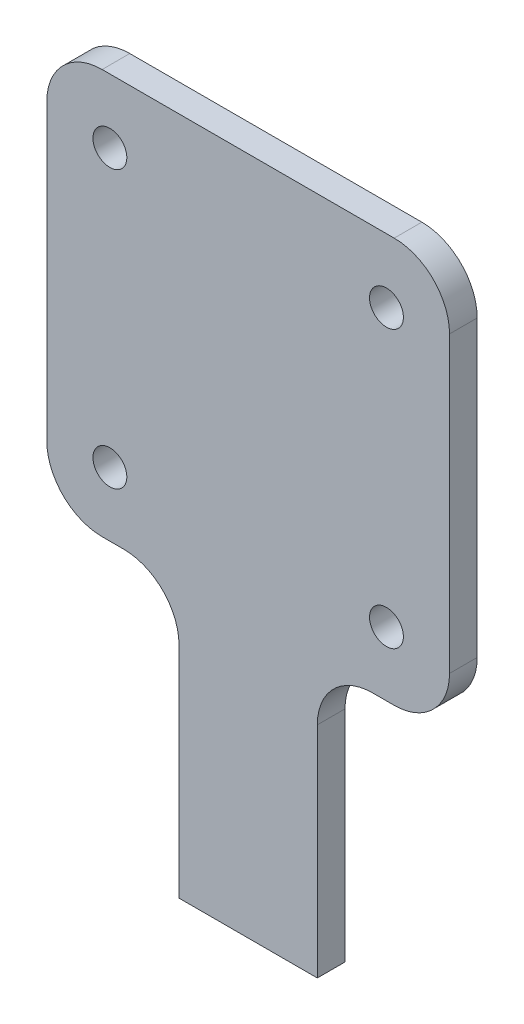
ISO-10303-21;
HEADER;
FILE_DESCRIPTION(('STEP AP214'),'2;1');
FILE_NAME('part.step','',(''),(''),'','','');
FILE_SCHEMA(('AUTOMOTIVE_DESIGN { 1 0 10303 214 1 1 1 1 }'));
ENDSEC;
DATA;
#1=APPLICATION_CONTEXT('core data for automotive mechanical design processes');
#2=APPLICATION_PROTOCOL_DEFINITION('international standard','automotive_design',2000,#1);
#3=PRODUCT_CONTEXT('',#1,'mechanical');
#4=PRODUCT('Part','Part','',(#3));
#5=PRODUCT_RELATED_PRODUCT_CATEGORY('part','',(#4));
#6=PRODUCT_DEFINITION_FORMATION('','',#4);
#7=PRODUCT_DEFINITION_CONTEXT('part definition',#1,'design');
#8=PRODUCT_DEFINITION('design','',#6,#7);
#9=PRODUCT_DEFINITION_SHAPE('','',#8);
#10=(LENGTH_UNIT() NAMED_UNIT(*) SI_UNIT(.MILLI.,.METRE.));
#11=(NAMED_UNIT(*) PLANE_ANGLE_UNIT() SI_UNIT($,.RADIAN.));
#12=(NAMED_UNIT(*) SI_UNIT($,.STERADIAN.) SOLID_ANGLE_UNIT());
#13=UNCERTAINTY_MEASURE_WITH_UNIT(LENGTH_MEASURE(1.E-05),#10,'distance_accuracy_value','');
#14=(GEOMETRIC_REPRESENTATION_CONTEXT(3) GLOBAL_UNCERTAINTY_ASSIGNED_CONTEXT((#13)) GLOBAL_UNIT_ASSIGNED_CONTEXT((#10,
#11,#12)) REPRESENTATION_CONTEXT('',''));
#15=CARTESIAN_POINT('',(0.,0.,0.));
#16=DIRECTION('',(0.,0.,1.));
#17=DIRECTION('',(1.,0.,0.));
#18=AXIS2_PLACEMENT_3D('',#15,#16,#17);
#19=CARTESIAN_POINT('',(-5.,19.8535588758529,1.));
#20=DIRECTION('',(1.,0.,0.));
#21=DIRECTION('',(0.,1.,0.));
#22=AXIS2_PLACEMENT_3D('',#19,#20,#21);
#23=PLANE('',#22);
#24=DIRECTION('',(0.,-1.,0.));
#25=VECTOR('',#24,1.);
#26=CARTESIAN_POINT('',(-5.,19.8535588758529,1.));
#27=LINE('',#26,#25);
#28=CARTESIAN_POINT('',(-5.,15.8535588758529,1.));
#29=VERTEX_POINT('',#28);
#30=CARTESIAN_POINT('',(-5.,0.,1.));
#31=VERTEX_POINT('',#30);
#32=EDGE_CURVE('E147',#29,#31,#27,.T.);
#33=ORIENTED_EDGE('',*,*,#32,.F.);
#34=DIRECTION('',(0.,0.,-1.));
#35=VECTOR('',#34,1.);
#36=CARTESIAN_POINT('',(-5.,15.8535588758529,-1.));
#37=LINE('',#36,#35);
#38=CARTESIAN_POINT('',(-5.,15.8535588758529,-1.));
#39=VERTEX_POINT('',#38);
#40=EDGE_CURVE('E192',#29,#39,#37,.T.);
#41=ORIENTED_EDGE('',*,*,#40,.T.);
#42=DIRECTION('',(0.,-1.,0.));
#43=VECTOR('',#42,1.);
#44=CARTESIAN_POINT('',(-5.,19.8535588758529,-1.));
#45=LINE('',#44,#43);
#46=CARTESIAN_POINT('',(-5.,0.,-1.));
#47=VERTEX_POINT('',#46);
#48=EDGE_CURVE('E173',#39,#47,#45,.T.);
#49=ORIENTED_EDGE('',*,*,#48,.T.);
#50=DIRECTION('',(0.,0.,-1.));
#51=VECTOR('',#50,1.);
#52=CARTESIAN_POINT('',(-5.,0.,1.));
#53=LINE('',#52,#51);
#54=EDGE_CURVE('E166',#31,#47,#53,.T.);
#55=ORIENTED_EDGE('',*,*,#54,.F.);
#56=EDGE_LOOP('',(#33,#41,#49,#55));
#57=FACE_BOUND('',#56,.T.);
#58=ADVANCED_FACE('F47',(#57),#23,.F.);
#59=CARTESIAN_POINT('',(5.,0.,1.));
#60=DIRECTION('',(0.,1.,0.));
#61=DIRECTION('',(-1.,0.,0.));
#62=AXIS2_PLACEMENT_3D('',#59,#60,#61);
#63=PLANE('',#62);
#64=DIRECTION('',(1.,0.,0.));
#65=VECTOR('',#64,1.);
#66=CARTESIAN_POINT('',(5.,0.,-1.));
#67=LINE('',#66,#65);
#68=CARTESIAN_POINT('',(5.,0.,-1.));
#69=VERTEX_POINT('',#68);
#70=EDGE_CURVE('E251',#47,#69,#67,.T.);
#71=ORIENTED_EDGE('',*,*,#70,.T.);
#72=DIRECTION('',(0.,0.,-1.));
#73=VECTOR('',#72,1.);
#74=CARTESIAN_POINT('',(5.,0.,1.));
#75=LINE('',#74,#73);
#76=CARTESIAN_POINT('',(5.,0.,1.));
#77=VERTEX_POINT('',#76);
#78=EDGE_CURVE('E168',#77,#69,#75,.T.);
#79=ORIENTED_EDGE('',*,*,#78,.F.);
#80=DIRECTION('',(1.,0.,0.));
#81=VECTOR('',#80,1.);
#82=CARTESIAN_POINT('',(5.,0.,1.));
#83=LINE('',#82,#81);
#84=EDGE_CURVE('E152',#31,#77,#83,.T.);
#85=ORIENTED_EDGE('',*,*,#84,.F.);
#86=ORIENTED_EDGE('',*,*,#54,.T.);
#87=EDGE_LOOP('',(#71,#79,#85,#86));
#88=FACE_BOUND('',#87,.T.);
#89=ADVANCED_FACE('F165',(#88),#63,.F.);
#90=CARTESIAN_POINT('',(4.99999999999999,19.8535588758529,1.));
#91=DIRECTION('',(-1.,0.,0.));
#92=DIRECTION('',(0.,-1.,0.));
#93=AXIS2_PLACEMENT_3D('',#90,#91,#92);
#94=PLANE('',#93);
#95=DIRECTION('',(0.,1.,0.));
#96=VECTOR('',#95,1.);
#97=CARTESIAN_POINT('',(4.99999999999999,19.8535588758529,-1.));
#98=LINE('',#97,#96);
#99=CARTESIAN_POINT('',(4.99999999999999,15.8535588758529,-1.));
#100=VERTEX_POINT('',#99);
#101=EDGE_CURVE('E243',#69,#100,#98,.T.);
#102=ORIENTED_EDGE('',*,*,#101,.T.);
#103=DIRECTION('',(0.,0.,-1.));
#104=VECTOR('',#103,1.);
#105=CARTESIAN_POINT('',(4.99999999999999,15.8535588758529,1.));
#106=LINE('',#105,#104);
#107=CARTESIAN_POINT('',(4.99999999999999,15.8535588758529,1.));
#108=VERTEX_POINT('',#107);
#109=EDGE_CURVE('E204',#100,#108,#106,.F.);
#110=ORIENTED_EDGE('',*,*,#109,.T.);
#111=DIRECTION('',(0.,1.,0.));
#112=VECTOR('',#111,1.);
#113=CARTESIAN_POINT('',(4.99999999999999,19.8535588758529,1.));
#114=LINE('',#113,#112);
#115=EDGE_CURVE('E170',#77,#108,#114,.T.);
#116=ORIENTED_EDGE('',*,*,#115,.F.);
#117=ORIENTED_EDGE('',*,*,#78,.T.);
#118=EDGE_LOOP('',(#102,#110,#116,#117));
#119=FACE_BOUND('',#118,.T.);
#120=ADVANCED_FACE('F250',(#119),#94,.F.);
#121=CARTESIAN_POINT('',(4.99999999999999,19.8535588758529,1.));
#122=DIRECTION('',(0.,1.,0.));
#123=DIRECTION('',(-1.,0.,0.));
#124=AXIS2_PLACEMENT_3D('',#121,#122,#123);
#125=PLANE('',#124);
#126=DIRECTION('',(1.,0.,0.));
#127=VECTOR('',#126,1.);
#128=CARTESIAN_POINT('',(4.99999999999999,19.8535588758529,1.));
#129=LINE('',#128,#127);
#130=CARTESIAN_POINT('',(8.99999999999999,19.8535588758529,1.));
#131=VERTEX_POINT('',#130);
#132=CARTESIAN_POINT('',(10.56,19.8535588758529,1.));
#133=VERTEX_POINT('',#132);
#134=EDGE_CURVE('E257',#131,#133,#129,.T.);
#135=ORIENTED_EDGE('',*,*,#134,.F.);
#136=DIRECTION('',(0.,0.,-1.));
#137=VECTOR('',#136,1.);
#138=CARTESIAN_POINT('',(8.99999999999999,19.8535588758529,-1.));
#139=LINE('',#138,#137);
#140=CARTESIAN_POINT('',(8.99999999999999,19.8535588758529,-1.));
#141=VERTEX_POINT('',#140);
#142=EDGE_CURVE('E201',#131,#141,#139,.T.);
#143=ORIENTED_EDGE('',*,*,#142,.T.);
#144=DIRECTION('',(1.,0.,0.));
#145=VECTOR('',#144,1.);
#146=CARTESIAN_POINT('',(4.99999999999999,19.8535588758529,-1.));
#147=LINE('',#146,#145);
#148=CARTESIAN_POINT('',(10.56,19.8535588758529,-1.));
#149=VERTEX_POINT('',#148);
#150=EDGE_CURVE('E245',#141,#149,#147,.T.);
#151=ORIENTED_EDGE('',*,*,#150,.T.);
#152=DIRECTION('',(0.,0.,-1.));
#153=VECTOR('',#152,1.);
#154=CARTESIAN_POINT('',(10.56,19.8535588758529,1.));
#155=LINE('',#154,#153);
#156=EDGE_CURVE('E199',#149,#133,#155,.F.);
#157=ORIENTED_EDGE('',*,*,#156,.T.);
#158=EDGE_LOOP('',(#135,#143,#151,#157));
#159=FACE_BOUND('',#158,.T.);
#160=ADVANCED_FACE('F260',(#159),#125,.F.);
#161=CARTESIAN_POINT('',(14.56,49.113558875853,1.));
#162=DIRECTION('',(-1.,0.,0.));
#163=DIRECTION('',(0.,-1.,0.));
#164=AXIS2_PLACEMENT_3D('',#161,#162,#163);
#165=PLANE('',#164);
#166=DIRECTION('',(0.,1.,0.));
#167=VECTOR('',#166,1.);
#168=CARTESIAN_POINT('',(14.56,49.113558875853,1.));
#169=LINE('',#168,#167);
#170=CARTESIAN_POINT('',(14.56,23.8535588758529,1.));
#171=VERTEX_POINT('',#170);
#172=CARTESIAN_POINT('',(14.56,45.113558875853,1.));
#173=VERTEX_POINT('',#172);
#174=EDGE_CURVE('E262',#171,#173,#169,.T.);
#175=ORIENTED_EDGE('',*,*,#174,.F.);
#176=DIRECTION('',(0.,0.,-1.));
#177=VECTOR('',#176,1.);
#178=CARTESIAN_POINT('',(14.56,23.8535588758529,1.));
#179=LINE('',#178,#177);
#180=CARTESIAN_POINT('',(14.56,23.8535588758529,-1.));
#181=VERTEX_POINT('',#180);
#182=EDGE_CURVE('E232',#171,#181,#179,.T.);
#183=ORIENTED_EDGE('',*,*,#182,.T.);
#184=DIRECTION('',(0.,1.,0.));
#185=VECTOR('',#184,1.);
#186=CARTESIAN_POINT('',(14.56,49.113558875853,-1.));
#187=LINE('',#186,#185);
#188=CARTESIAN_POINT('',(14.56,45.113558875853,-1.));
#189=VERTEX_POINT('',#188);
#190=EDGE_CURVE('E276',#181,#189,#187,.T.);
#191=ORIENTED_EDGE('',*,*,#190,.T.);
#192=DIRECTION('',(0.,0.,-1.));
#193=VECTOR('',#192,1.);
#194=CARTESIAN_POINT('',(14.56,45.113558875853,1.));
#195=LINE('',#194,#193);
#196=EDGE_CURVE('E230',#189,#173,#195,.F.);
#197=ORIENTED_EDGE('',*,*,#196,.T.);
#198=EDGE_LOOP('',(#175,#183,#191,#197));
#199=FACE_BOUND('',#198,.T.);
#200=ADVANCED_FACE('F438',(#199),#165,.F.);
#201=CARTESIAN_POINT('',(-14.56,49.113558875853,1.));
#202=DIRECTION('',(0.,-1.,0.));
#203=DIRECTION('',(0.,0.,-1.));
#204=AXIS2_PLACEMENT_3D('',#201,#202,#203);
#205=PLANE('',#204);
#206=DIRECTION('',(-1.,0.,0.));
#207=VECTOR('',#206,1.);
#208=CARTESIAN_POINT('',(-14.56,49.113558875853,-1.));
#209=LINE('',#208,#207);
#210=CARTESIAN_POINT('',(10.56,49.113558875853,-1.));
#211=VERTEX_POINT('',#210);
#212=CARTESIAN_POINT('',(-10.56,49.113558875853,-1.));
#213=VERTEX_POINT('',#212);
#214=EDGE_CURVE('E279',#211,#213,#209,.T.);
#215=ORIENTED_EDGE('',*,*,#214,.T.);
#216=DIRECTION('',(0.,0.,-1.));
#217=VECTOR('',#216,1.);
#218=CARTESIAN_POINT('',(-10.56,49.113558875853,1.));
#219=LINE('',#218,#217);
#220=CARTESIAN_POINT('',(-10.56,49.113558875853,1.));
#221=VERTEX_POINT('',#220);
#222=EDGE_CURVE('E62',#213,#221,#219,.F.);
#223=ORIENTED_EDGE('',*,*,#222,.T.);
#224=DIRECTION('',(-1.,0.,0.));
#225=VECTOR('',#224,1.);
#226=CARTESIAN_POINT('',(-14.56,49.113558875853,1.));
#227=LINE('',#226,#225);
#228=CARTESIAN_POINT('',(10.56,49.113558875853,1.));
#229=VERTEX_POINT('',#228);
#230=EDGE_CURVE('E264',#229,#221,#227,.T.);
#231=ORIENTED_EDGE('',*,*,#230,.F.);
#232=DIRECTION('',(0.,0.,-1.));
#233=VECTOR('',#232,1.);
#234=CARTESIAN_POINT('',(10.56,49.113558875853,1.));
#235=LINE('',#234,#233);
#236=EDGE_CURVE('E226',#229,#211,#235,.T.);
#237=ORIENTED_EDGE('',*,*,#236,.T.);
#238=EDGE_LOOP('',(#215,#223,#231,#237));
#239=FACE_BOUND('',#238,.T.);
#240=ADVANCED_FACE('F434',(#239),#205,.F.);
#241=CARTESIAN_POINT('',(-14.56,49.113558875853,1.));
#242=DIRECTION('',(1.,0.,0.));
#243=DIRECTION('',(0.,1.,0.));
#244=AXIS2_PLACEMENT_3D('',#241,#242,#243);
#245=PLANE('',#244);
#246=DIRECTION('',(0.,-1.,0.));
#247=VECTOR('',#246,1.);
#248=CARTESIAN_POINT('',(-14.56,49.113558875853,-1.));
#249=LINE('',#248,#247);
#250=CARTESIAN_POINT('',(-14.56,45.113558875853,-1.));
#251=VERTEX_POINT('',#250);
#252=CARTESIAN_POINT('',(-14.56,23.8535588758529,-1.));
#253=VERTEX_POINT('',#252);
#254=EDGE_CURVE('E281',#251,#253,#249,.T.);
#255=ORIENTED_EDGE('',*,*,#254,.T.);
#256=DIRECTION('',(0.,0.,-1.));
#257=VECTOR('',#256,1.);
#258=CARTESIAN_POINT('',(-14.56,23.8535588758529,1.));
#259=LINE('',#258,#257);
#260=CARTESIAN_POINT('',(-14.56,23.8535588758529,1.));
#261=VERTEX_POINT('',#260);
#262=EDGE_CURVE('E217',#253,#261,#259,.F.);
#263=ORIENTED_EDGE('',*,*,#262,.T.);
#264=DIRECTION('',(0.,-1.,0.));
#265=VECTOR('',#264,1.);
#266=CARTESIAN_POINT('',(-14.56,49.113558875853,1.));
#267=LINE('',#266,#265);
#268=CARTESIAN_POINT('',(-14.56,45.113558875853,1.));
#269=VERTEX_POINT('',#268);
#270=EDGE_CURVE('E269',#269,#261,#267,.T.);
#271=ORIENTED_EDGE('',*,*,#270,.F.);
#272=DIRECTION('',(0.,0.,-1.));
#273=VECTOR('',#272,1.);
#274=CARTESIAN_POINT('',(-14.56,45.113558875853,1.));
#275=LINE('',#274,#273);
#276=EDGE_CURVE('E214',#269,#251,#275,.T.);
#277=ORIENTED_EDGE('',*,*,#276,.T.);
#278=EDGE_LOOP('',(#255,#263,#271,#277));
#279=FACE_BOUND('',#278,.T.);
#280=ADVANCED_FACE('F431',(#279),#245,.F.);
#281=CARTESIAN_POINT('',(-14.56,19.8535588758529,1.));
#282=DIRECTION('',(0.,1.,0.));
#283=DIRECTION('',(0.,0.,1.));
#284=AXIS2_PLACEMENT_3D('',#281,#282,#283);
#285=PLANE('',#284);
#286=DIRECTION('',(1.,0.,0.));
#287=VECTOR('',#286,1.);
#288=CARTESIAN_POINT('',(-14.56,19.8535588758529,-1.));
#289=LINE('',#288,#287);
#290=CARTESIAN_POINT('',(-10.56,19.8535588758529,-1.));
#291=VERTEX_POINT('',#290);
#292=CARTESIAN_POINT('',(-9.,19.8535588758529,-1.));
#293=VERTEX_POINT('',#292);
#294=EDGE_CURVE('E161',#291,#293,#289,.T.);
#295=ORIENTED_EDGE('',*,*,#294,.T.);
#296=DIRECTION('',(0.,0.,-1.));
#297=VECTOR('',#296,1.);
#298=CARTESIAN_POINT('',(-9.,19.8535588758529,1.));
#299=LINE('',#298,#297);
#300=CARTESIAN_POINT('',(-9.,19.8535588758529,1.));
#301=VERTEX_POINT('',#300);
#302=EDGE_CURVE('E197',#293,#301,#299,.F.);
#303=ORIENTED_EDGE('',*,*,#302,.T.);
#304=DIRECTION('',(1.,0.,0.));
#305=VECTOR('',#304,1.);
#306=CARTESIAN_POINT('',(-14.56,19.8535588758529,1.));
#307=LINE('',#306,#305);
#308=CARTESIAN_POINT('',(-10.56,19.8535588758529,1.));
#309=VERTEX_POINT('',#308);
#310=EDGE_CURVE('E180',#309,#301,#307,.T.);
#311=ORIENTED_EDGE('',*,*,#310,.F.);
#312=DIRECTION('',(0.,0.,-1.));
#313=VECTOR('',#312,1.);
#314=CARTESIAN_POINT('',(-10.56,19.8535588758529,1.));
#315=LINE('',#314,#313);
#316=EDGE_CURVE('E194',#309,#291,#315,.T.);
#317=ORIENTED_EDGE('',*,*,#316,.T.);
#318=EDGE_LOOP('',(#295,#303,#311,#317));
#319=FACE_BOUND('',#318,.T.);
#320=ADVANCED_FACE('F286',(#319),#285,.F.);
#321=CARTESIAN_POINT('',(0.,0.,1.));
#322=DIRECTION('',(0.,0.,-1.));
#323=DIRECTION('',(-1.,0.,0.));
#324=AXIS2_PLACEMENT_3D('',#321,#322,#323);
#325=PLANE('',#324);
#326=CARTESIAN_POINT('',(10.0000000000003,24.4835588758528,1.));
#327=DIRECTION('',(0.,0.,-1.));
#328=DIRECTION('',(-1.,0.,0.));
#329=AXIS2_PLACEMENT_3D('',#326,#327,#328);
#330=CIRCLE('',#329,1.2250000000004);
#331=CARTESIAN_POINT('',(8.77499999999994,24.4835588758528,1.));
#332=VERTEX_POINT('',#331);
#333=EDGE_CURVE('E383',#332,#332,#330,.F.);
#334=ORIENTED_EDGE('',*,*,#333,.F.);
#335=EDGE_LOOP('',(#334));
#336=FACE_BOUND('',#335,.T.);
#337=CARTESIAN_POINT('',(-9.99999999999966,24.4835588758528,1.));
#338=DIRECTION('',(0.,0.,-1.));
#339=DIRECTION('',(-1.,0.,0.));
#340=AXIS2_PLACEMENT_3D('',#337,#338,#339);
#341=CIRCLE('',#340,1.2250000000004);
#342=CARTESIAN_POINT('',(-11.2250000000001,24.4835588758528,1.));
#343=VERTEX_POINT('',#342);
#344=EDGE_CURVE('E380',#343,#343,#341,.F.);
#345=ORIENTED_EDGE('',*,*,#344,.F.);
#346=EDGE_LOOP('',(#345));
#347=FACE_BOUND('',#346,.T.);
#348=CARTESIAN_POINT('',(-9.99999999999965,44.4835588758528,1.));
#349=DIRECTION('',(0.,0.,-1.));
#350=DIRECTION('',(-1.,0.,0.));
#351=AXIS2_PLACEMENT_3D('',#348,#349,#350);
#352=CIRCLE('',#351,1.2250000000004);
#353=CARTESIAN_POINT('',(-11.2250000000001,44.4835588758528,1.));
#354=VERTEX_POINT('',#353);
#355=EDGE_CURVE('E374',#354,#354,#352,.F.);
#356=ORIENTED_EDGE('',*,*,#355,.F.);
#357=EDGE_LOOP('',(#356));
#358=FACE_BOUND('',#357,.T.);
#359=CARTESIAN_POINT('',(10.0000000000003,44.4835588758528,1.));
#360=DIRECTION('',(0.,0.,-1.));
#361=DIRECTION('',(-1.,0.,0.));
#362=AXIS2_PLACEMENT_3D('',#359,#360,#361);
#363=CIRCLE('',#362,1.2250000000004);
#364=CARTESIAN_POINT('',(8.77499999999995,44.4835588758528,1.));
#365=VERTEX_POINT('',#364);
#366=EDGE_CURVE('E371',#365,#365,#363,.F.);
#367=ORIENTED_EDGE('',*,*,#366,.F.);
#368=EDGE_LOOP('',(#367));
#369=FACE_BOUND('',#368,.T.);
#370=ORIENTED_EDGE('',*,*,#270,.T.);
#371=CARTESIAN_POINT('',(-10.56,23.8535588758529,1.));
#372=DIRECTION('',(0.,0.,-1.));
#373=DIRECTION('',(-1.,0.,0.));
#374=AXIS2_PLACEMENT_3D('',#371,#372,#373);
#375=CIRCLE('',#374,4.);
#376=EDGE_CURVE('E224',#261,#309,#375,.F.);
#377=ORIENTED_EDGE('',*,*,#376,.T.);
#378=ORIENTED_EDGE('',*,*,#310,.T.);
#379=CARTESIAN_POINT('',(-9.,15.8535588758529,1.));
#380=DIRECTION('',(0.,0.,-1.));
#381=DIRECTION('',(-1.,0.,0.));
#382=AXIS2_PLACEMENT_3D('',#379,#380,#381);
#383=CIRCLE('',#382,4.);
#384=EDGE_CURVE('E156',#301,#29,#383,.T.);
#385=ORIENTED_EDGE('',*,*,#384,.T.);
#386=ORIENTED_EDGE('',*,*,#32,.T.);
#387=ORIENTED_EDGE('',*,*,#84,.T.);
#388=ORIENTED_EDGE('',*,*,#115,.T.);
#389=CARTESIAN_POINT('',(8.99999999999999,15.8535588758529,1.));
#390=DIRECTION('',(0.,0.,-1.));
#391=DIRECTION('',(-1.,0.,0.));
#392=AXIS2_PLACEMENT_3D('',#389,#390,#391);
#393=CIRCLE('',#392,4.);
#394=EDGE_CURVE('E13',#108,#131,#393,.T.);
#395=ORIENTED_EDGE('',*,*,#394,.T.);
#396=ORIENTED_EDGE('',*,*,#134,.T.);
#397=CARTESIAN_POINT('',(10.56,23.8535588758529,1.));
#398=DIRECTION('',(0.,0.,-1.));
#399=DIRECTION('',(-1.,0.,0.));
#400=AXIS2_PLACEMENT_3D('',#397,#398,#399);
#401=CIRCLE('',#400,4.);
#402=EDGE_CURVE('E220',#133,#171,#401,.F.);
#403=ORIENTED_EDGE('',*,*,#402,.T.);
#404=ORIENTED_EDGE('',*,*,#174,.T.);
#405=CARTESIAN_POINT('',(10.56,45.113558875853,1.));
#406=DIRECTION('',(0.,0.,-1.));
#407=DIRECTION('',(-1.,0.,0.));
#408=AXIS2_PLACEMENT_3D('',#405,#406,#407);
#409=CIRCLE('',#408,4.);
#410=EDGE_CURVE('E69',#173,#229,#409,.F.);
#411=ORIENTED_EDGE('',*,*,#410,.T.);
#412=ORIENTED_EDGE('',*,*,#230,.T.);
#413=CARTESIAN_POINT('',(-10.56,45.113558875853,1.));
#414=DIRECTION('',(0.,0.,-1.));
#415=DIRECTION('',(-1.,0.,0.));
#416=AXIS2_PLACEMENT_3D('',#413,#414,#415);
#417=CIRCLE('',#416,4.);
#418=EDGE_CURVE('E222',#221,#269,#417,.F.);
#419=ORIENTED_EDGE('',*,*,#418,.T.);
#420=EDGE_LOOP('',(#370,#377,#378,#385,#386,#387,#388,#395,#396,#403,#404,#411,#412,#419));
#421=FACE_BOUND('',#420,.T.);
#422=ADVANCED_FACE('F150',(#336,#347,#358,#369,#421),#325,.F.);
#423=CARTESIAN_POINT('',(0.,0.,-1.));
#424=DIRECTION('',(0.,0.,-1.));
#425=DIRECTION('',(-1.,0.,0.));
#426=AXIS2_PLACEMENT_3D('',#423,#424,#425);
#427=PLANE('',#426);
#428=CARTESIAN_POINT('',(-9.99999999999966,24.4835588758528,-1.));
#429=DIRECTION('',(0.,0.,-1.));
#430=DIRECTION('',(-1.,0.,0.));
#431=AXIS2_PLACEMENT_3D('',#428,#429,#430);
#432=CIRCLE('',#431,3.72500000000036);
#433=CARTESIAN_POINT('',(-13.725,24.4835588758528,-1.));
#434=VERTEX_POINT('',#433);
#435=EDGE_CURVE('E189',#434,#434,#432,.F.);
#436=ORIENTED_EDGE('',*,*,#435,.T.);
#437=EDGE_LOOP('',(#436));
#438=FACE_BOUND('',#437,.T.);
#439=CARTESIAN_POINT('',(10.0000000000003,24.4835588758528,-1.));
#440=DIRECTION('',(0.,0.,-1.));
#441=DIRECTION('',(-1.,0.,0.));
#442=AXIS2_PLACEMENT_3D('',#439,#440,#441);
#443=CIRCLE('',#442,3.72500000000036);
#444=CARTESIAN_POINT('',(6.27499999999998,24.4835588758528,-1.));
#445=VERTEX_POINT('',#444);
#446=EDGE_CURVE('E186',#445,#445,#443,.F.);
#447=ORIENTED_EDGE('',*,*,#446,.T.);
#448=EDGE_LOOP('',(#447));
#449=FACE_BOUND('',#448,.T.);
#450=CARTESIAN_POINT('',(-9.99999999999965,44.4835588758528,-1.));
#451=DIRECTION('',(0.,0.,-1.));
#452=DIRECTION('',(-1.,0.,0.));
#453=AXIS2_PLACEMENT_3D('',#450,#451,#452);
#454=CIRCLE('',#453,3.72500000000036);
#455=CARTESIAN_POINT('',(-13.725,44.4835588758528,-1.));
#456=VERTEX_POINT('',#455);
#457=EDGE_CURVE('E178',#456,#456,#454,.F.);
#458=ORIENTED_EDGE('',*,*,#457,.T.);
#459=EDGE_LOOP('',(#458));
#460=FACE_BOUND('',#459,.T.);
#461=CARTESIAN_POINT('',(10.0000000000003,44.4835588758528,-1.));
#462=DIRECTION('',(0.,0.,-1.));
#463=DIRECTION('',(-1.,0.,0.));
#464=AXIS2_PLACEMENT_3D('',#461,#462,#463);
#465=CIRCLE('',#464,3.72500000000036);
#466=CARTESIAN_POINT('',(6.27499999999999,44.4835588758528,-1.));
#467=VERTEX_POINT('',#466);
#468=EDGE_CURVE('E175',#467,#467,#465,.F.);
#469=ORIENTED_EDGE('',*,*,#468,.T.);
#470=EDGE_LOOP('',(#469));
#471=FACE_BOUND('',#470,.T.);
#472=ORIENTED_EDGE('',*,*,#294,.F.);
#473=CARTESIAN_POINT('',(-10.56,23.8535588758529,-1.));
#474=DIRECTION('',(0.,0.,-1.));
#475=DIRECTION('',(-1.,0.,0.));
#476=AXIS2_PLACEMENT_3D('',#473,#474,#475);
#477=CIRCLE('',#476,4.);
#478=EDGE_CURVE('E212',#291,#253,#477,.T.);
#479=ORIENTED_EDGE('',*,*,#478,.T.);
#480=ORIENTED_EDGE('',*,*,#254,.F.);
#481=CARTESIAN_POINT('',(-10.56,45.113558875853,-1.));
#482=DIRECTION('',(0.,0.,-1.));
#483=DIRECTION('',(-1.,0.,0.));
#484=AXIS2_PLACEMENT_3D('',#481,#482,#483);
#485=CIRCLE('',#484,4.);
#486=EDGE_CURVE('E210',#251,#213,#485,.T.);
#487=ORIENTED_EDGE('',*,*,#486,.T.);
#488=ORIENTED_EDGE('',*,*,#214,.F.);
#489=CARTESIAN_POINT('',(10.56,45.113558875853,-1.));
#490=DIRECTION('',(0.,0.,-1.));
#491=DIRECTION('',(-1.,0.,0.));
#492=AXIS2_PLACEMENT_3D('',#489,#490,#491);
#493=CIRCLE('',#492,4.);
#494=EDGE_CURVE('E206',#211,#189,#493,.T.);
#495=ORIENTED_EDGE('',*,*,#494,.T.);
#496=ORIENTED_EDGE('',*,*,#190,.F.);
#497=CARTESIAN_POINT('',(10.56,23.8535588758529,-1.));
#498=DIRECTION('',(0.,0.,-1.));
#499=DIRECTION('',(-1.,0.,0.));
#500=AXIS2_PLACEMENT_3D('',#497,#498,#499);
#501=CIRCLE('',#500,4.);
#502=EDGE_CURVE('E208',#181,#149,#501,.T.);
#503=ORIENTED_EDGE('',*,*,#502,.T.);
#504=ORIENTED_EDGE('',*,*,#150,.F.);
#505=CARTESIAN_POINT('',(8.99999999999999,15.8535588758529,-1.));
#506=DIRECTION('',(0.,0.,-1.));
#507=DIRECTION('',(-1.,0.,0.));
#508=AXIS2_PLACEMENT_3D('',#505,#506,#507);
#509=CIRCLE('',#508,4.);
#510=EDGE_CURVE('E55',#141,#100,#509,.F.);
#511=ORIENTED_EDGE('',*,*,#510,.T.);
#512=ORIENTED_EDGE('',*,*,#101,.F.);
#513=ORIENTED_EDGE('',*,*,#70,.F.);
#514=ORIENTED_EDGE('',*,*,#48,.F.);
#515=CARTESIAN_POINT('',(-9.,15.8535588758529,-1.));
#516=DIRECTION('',(0.,0.,-1.));
#517=DIRECTION('',(-1.,0.,0.));
#518=AXIS2_PLACEMENT_3D('',#515,#516,#517);
#519=CIRCLE('',#518,4.);
#520=EDGE_CURVE('E235',#39,#293,#519,.F.);
#521=ORIENTED_EDGE('',*,*,#520,.T.);
#522=EDGE_LOOP('',(#472,#479,#480,#487,#488,#495,#496,#503,#504,#511,#512,#513,#514,#521));
#523=FACE_BOUND('',#522,.T.);
#524=ADVANCED_FACE('F242',(#438,#449,#460,#471,#523),#427,.T.);
#525=CARTESIAN_POINT('',(10.0000000000003,44.4835588758528,-3.));
#526=DIRECTION('',(0.,0.,-1.));
#527=DIRECTION('',(-1.,0.,0.));
#528=AXIS2_PLACEMENT_3D('',#525,#526,#527);
#529=PLANE('',#528);
#530=CARTESIAN_POINT('',(10.0000000000003,44.4835588758528,-3.));
#531=DIRECTION('',(0.,0.,-1.));
#532=DIRECTION('',(-1.,0.,0.));
#533=AXIS2_PLACEMENT_3D('',#530,#531,#532);
#534=CIRCLE('',#533,1.72500000000036);
#535=CARTESIAN_POINT('',(8.27499999999999,44.4835588758528,-3.));
#536=VERTEX_POINT('',#535);
#537=EDGE_CURVE('E273',#536,#536,#534,.T.);
#538=ORIENTED_EDGE('',*,*,#537,.T.);
#539=EDGE_LOOP('',(#538));
#540=FACE_BOUND('',#539,.T.);
#541=CARTESIAN_POINT('',(10.0000000000003,44.4835588758528,-3.));
#542=DIRECTION('',(0.,0.,-1.));
#543=DIRECTION('',(-1.,0.,0.));
#544=AXIS2_PLACEMENT_3D('',#541,#542,#543);
#545=CIRCLE('',#544,1.2250000000004);
#546=CARTESIAN_POINT('',(8.77499999999995,44.4835588758528,-3.));
#547=VERTEX_POINT('',#546);
#548=EDGE_CURVE('E344',#547,#547,#545,.T.);
#549=ORIENTED_EDGE('',*,*,#548,.F.);
#550=EDGE_LOOP('',(#549));
#551=FACE_BOUND('',#550,.T.);
#552=ADVANCED_FACE('F357',(#540,#551),#529,.T.);
#553=CARTESIAN_POINT('',(10.0000000000003,44.4835588758528,-3.));
#554=DIRECTION('',(0.,0.,1.));
#555=DIRECTION('',(1.,0.,0.));
#556=AXIS2_PLACEMENT_3D('',#553,#554,#555);
#557=CYLINDRICAL_SURFACE('',#556,1.2250000000004);
#558=ORIENTED_EDGE('',*,*,#548,.T.);
#559=EDGE_LOOP('',(#558));
#560=FACE_BOUND('',#559,.T.);
#561=ORIENTED_EDGE('',*,*,#366,.T.);
#562=EDGE_LOOP('',(#561));
#563=FACE_BOUND('',#562,.T.);
#564=ADVANCED_FACE('F361',(#560,#563),#557,.F.);
#565=CARTESIAN_POINT('',(-9.99999999999965,44.4835588758528,-3.));
#566=DIRECTION('',(0.,0.,-1.));
#567=DIRECTION('',(-1.,0.,0.));
#568=AXIS2_PLACEMENT_3D('',#565,#566,#567);
#569=PLANE('',#568);
#570=CARTESIAN_POINT('',(-9.99999999999965,44.4835588758528,-3.));
#571=DIRECTION('',(0.,0.,-1.));
#572=DIRECTION('',(-1.,0.,0.));
#573=AXIS2_PLACEMENT_3D('',#570,#571,#572);
#574=CIRCLE('',#573,1.72500000000036);
#575=CARTESIAN_POINT('',(-11.725,44.4835588758528,-3.));
#576=VERTEX_POINT('',#575);
#577=EDGE_CURVE('E342',#576,#576,#574,.T.);
#578=ORIENTED_EDGE('',*,*,#577,.T.);
#579=EDGE_LOOP('',(#578));
#580=FACE_BOUND('',#579,.T.);
#581=CARTESIAN_POINT('',(-9.99999999999965,44.4835588758528,-3.));
#582=DIRECTION('',(0.,0.,-1.));
#583=DIRECTION('',(-1.,0.,0.));
#584=AXIS2_PLACEMENT_3D('',#581,#582,#583);
#585=CIRCLE('',#584,1.2250000000004);
#586=CARTESIAN_POINT('',(-11.2250000000001,44.4835588758528,-3.));
#587=VERTEX_POINT('',#586);
#588=EDGE_CURVE('E345',#587,#587,#585,.T.);
#589=ORIENTED_EDGE('',*,*,#588,.F.);
#590=EDGE_LOOP('',(#589));
#591=FACE_BOUND('',#590,.T.);
#592=ADVANCED_FACE('F367',(#580,#591),#569,.T.);
#593=CARTESIAN_POINT('',(-9.99999999999965,44.4835588758528,-3.));
#594=DIRECTION('',(0.,0.,1.));
#595=DIRECTION('',(1.,0.,0.));
#596=AXIS2_PLACEMENT_3D('',#593,#594,#595);
#597=CYLINDRICAL_SURFACE('',#596,1.2250000000004);
#598=ORIENTED_EDGE('',*,*,#588,.T.);
#599=EDGE_LOOP('',(#598));
#600=FACE_BOUND('',#599,.T.);
#601=ORIENTED_EDGE('',*,*,#355,.T.);
#602=EDGE_LOOP('',(#601));
#603=FACE_BOUND('',#602,.T.);
#604=ADVANCED_FACE('F398',(#600,#603),#597,.F.);
#605=CARTESIAN_POINT('',(10.0000000000003,24.4835588758528,-3.));
#606=DIRECTION('',(0.,0.,-1.));
#607=DIRECTION('',(-1.,0.,0.));
#608=AXIS2_PLACEMENT_3D('',#605,#606,#607);
#609=PLANE('',#608);
#610=CARTESIAN_POINT('',(10.0000000000003,24.4835588758528,-3.));
#611=DIRECTION('',(0.,0.,-1.));
#612=DIRECTION('',(-1.,0.,0.));
#613=AXIS2_PLACEMENT_3D('',#610,#611,#612);
#614=CIRCLE('',#613,1.72500000000036);
#615=CARTESIAN_POINT('',(8.27499999999998,24.4835588758528,-3.));
#616=VERTEX_POINT('',#615);
#617=EDGE_CURVE('E350',#616,#616,#614,.T.);
#618=ORIENTED_EDGE('',*,*,#617,.T.);
#619=EDGE_LOOP('',(#618));
#620=FACE_BOUND('',#619,.T.);
#621=CARTESIAN_POINT('',(10.0000000000003,24.4835588758528,-3.));
#622=DIRECTION('',(0.,0.,-1.));
#623=DIRECTION('',(-1.,0.,0.));
#624=AXIS2_PLACEMENT_3D('',#621,#622,#623);
#625=CIRCLE('',#624,1.2250000000004);
#626=CARTESIAN_POINT('',(8.77499999999994,24.4835588758528,-3.));
#627=VERTEX_POINT('',#626);
#628=EDGE_CURVE('E388',#627,#627,#625,.T.);
#629=ORIENTED_EDGE('',*,*,#628,.F.);
#630=EDGE_LOOP('',(#629));
#631=FACE_BOUND('',#630,.T.);
#632=ADVANCED_FACE('F393',(#620,#631),#609,.T.);
#633=CARTESIAN_POINT('',(10.0000000000003,24.4835588758528,-3.));
#634=DIRECTION('',(0.,0.,1.));
#635=DIRECTION('',(1.,0.,0.));
#636=AXIS2_PLACEMENT_3D('',#633,#634,#635);
#637=CYLINDRICAL_SURFACE('',#636,1.2250000000004);
#638=ORIENTED_EDGE('',*,*,#628,.T.);
#639=EDGE_LOOP('',(#638));
#640=FACE_BOUND('',#639,.T.);
#641=ORIENTED_EDGE('',*,*,#333,.T.);
#642=EDGE_LOOP('',(#641));
#643=FACE_BOUND('',#642,.T.);
#644=ADVANCED_FACE('F397',(#640,#643),#637,.F.);
#645=CARTESIAN_POINT('',(-9.99999999999966,24.4835588758528,-3.));
#646=DIRECTION('',(0.,0.,-1.));
#647=DIRECTION('',(-1.,0.,0.));
#648=AXIS2_PLACEMENT_3D('',#645,#646,#647);
#649=PLANE('',#648);
#650=CARTESIAN_POINT('',(-9.99999999999966,24.4835588758528,-3.));
#651=DIRECTION('',(0.,0.,-1.));
#652=DIRECTION('',(-1.,0.,0.));
#653=AXIS2_PLACEMENT_3D('',#650,#651,#652);
#654=CIRCLE('',#653,1.72500000000036);
#655=CARTESIAN_POINT('',(-11.725,24.4835588758528,-3.));
#656=VERTEX_POINT('',#655);
#657=EDGE_CURVE('E377',#656,#656,#654,.T.);
#658=ORIENTED_EDGE('',*,*,#657,.T.);
#659=EDGE_LOOP('',(#658));
#660=FACE_BOUND('',#659,.T.);
#661=CARTESIAN_POINT('',(-9.99999999999966,24.4835588758528,-3.));
#662=DIRECTION('',(0.,0.,-1.));
#663=DIRECTION('',(-1.,0.,0.));
#664=AXIS2_PLACEMENT_3D('',#661,#662,#663);
#665=CIRCLE('',#664,1.2250000000004);
#666=CARTESIAN_POINT('',(-11.2250000000001,24.4835588758528,-3.));
#667=VERTEX_POINT('',#666);
#668=EDGE_CURVE('E373',#667,#667,#665,.T.);
#669=ORIENTED_EDGE('',*,*,#668,.F.);
#670=EDGE_LOOP('',(#669));
#671=FACE_BOUND('',#670,.T.);
#672=ADVANCED_FACE('F404',(#660,#671),#649,.T.);
#673=CARTESIAN_POINT('',(-9.99999999999966,24.4835588758528,-3.));
#674=DIRECTION('',(0.,0.,1.));
#675=DIRECTION('',(1.,0.,0.));
#676=AXIS2_PLACEMENT_3D('',#673,#674,#675);
#677=CYLINDRICAL_SURFACE('',#676,1.2250000000004);
#678=ORIENTED_EDGE('',*,*,#668,.T.);
#679=EDGE_LOOP('',(#678));
#680=FACE_BOUND('',#679,.T.);
#681=ORIENTED_EDGE('',*,*,#344,.T.);
#682=EDGE_LOOP('',(#681));
#683=FACE_BOUND('',#682,.T.);
#684=ADVANCED_FACE('F321',(#680,#683),#677,.F.);
#685=CARTESIAN_POINT('',(-9.99999999999966,24.4835588758528,-3.00000000000002));
#686=DIRECTION('',(0.,0.,1.));
#687=DIRECTION('',(1.,0.,0.));
#688=AXIS2_PLACEMENT_3D('',#685,#686,#687);
#689=CONICAL_SURFACE('',#688,1.72500000000036,0.785398163397444);
#690=ORIENTED_EDGE('',*,*,#435,.F.);
#691=EDGE_LOOP('',(#690));
#692=FACE_BOUND('',#691,.T.);
#693=ORIENTED_EDGE('',*,*,#657,.F.);
#694=EDGE_LOOP('',(#693));
#695=FACE_BOUND('',#694,.T.);
#696=ADVANCED_FACE('F314',(#692,#695),#689,.T.);
#697=CARTESIAN_POINT('',(10.0000000000003,24.4835588758528,-3.00000000000002));
#698=DIRECTION('',(0.,0.,1.));
#699=DIRECTION('',(1.,0.,0.));
#700=AXIS2_PLACEMENT_3D('',#697,#698,#699);
#701=CONICAL_SURFACE('',#700,1.72500000000036,0.785398163397444);
#702=ORIENTED_EDGE('',*,*,#446,.F.);
#703=EDGE_LOOP('',(#702));
#704=FACE_BOUND('',#703,.T.);
#705=ORIENTED_EDGE('',*,*,#617,.F.);
#706=EDGE_LOOP('',(#705));
#707=FACE_BOUND('',#706,.T.);
#708=ADVANCED_FACE('F320',(#704,#707),#701,.T.);
#709=CARTESIAN_POINT('',(-9.99999999999965,44.4835588758528,-3.00000000000001));
#710=DIRECTION('',(0.,0.,1.));
#711=DIRECTION('',(1.,0.,0.));
#712=AXIS2_PLACEMENT_3D('',#709,#710,#711);
#713=CONICAL_SURFACE('',#712,1.72500000000036,0.785398163397444);
#714=ORIENTED_EDGE('',*,*,#457,.F.);
#715=EDGE_LOOP('',(#714));
#716=FACE_BOUND('',#715,.T.);
#717=ORIENTED_EDGE('',*,*,#577,.F.);
#718=EDGE_LOOP('',(#717));
#719=FACE_BOUND('',#718,.T.);
#720=ADVANCED_FACE('F300',(#716,#719),#713,.T.);
#721=CARTESIAN_POINT('',(10.0000000000003,44.4835588758528,-3.00000000000002));
#722=DIRECTION('',(0.,0.,1.));
#723=DIRECTION('',(1.,0.,0.));
#724=AXIS2_PLACEMENT_3D('',#721,#722,#723);
#725=CONICAL_SURFACE('',#724,1.72500000000036,0.785398163397444);
#726=ORIENTED_EDGE('',*,*,#468,.F.);
#727=EDGE_LOOP('',(#726));
#728=FACE_BOUND('',#727,.T.);
#729=ORIENTED_EDGE('',*,*,#537,.F.);
#730=EDGE_LOOP('',(#729));
#731=FACE_BOUND('',#730,.T.);
#732=ADVANCED_FACE('F292',(#728,#731),#725,.T.);
#733=CARTESIAN_POINT('',(-9.,15.8535588758529,1.));
#734=DIRECTION('',(0.,0.,1.));
#735=DIRECTION('',(1.,0.,0.));
#736=AXIS2_PLACEMENT_3D('',#733,#734,#735);
#737=CYLINDRICAL_SURFACE('',#736,4.);
#738=ORIENTED_EDGE('',*,*,#384,.F.);
#739=ORIENTED_EDGE('',*,*,#302,.F.);
#740=ORIENTED_EDGE('',*,*,#520,.F.);
#741=ORIENTED_EDGE('',*,*,#40,.F.);
#742=EDGE_LOOP('',(#738,#739,#740,#741));
#743=FACE_BOUND('',#742,.T.);
#744=ADVANCED_FACE('F290',(#743),#737,.F.);
#745=CARTESIAN_POINT('',(8.99999999999999,15.8535588758529,1.));
#746=DIRECTION('',(0.,0.,1.));
#747=DIRECTION('',(1.,0.,0.));
#748=AXIS2_PLACEMENT_3D('',#745,#746,#747);
#749=CYLINDRICAL_SURFACE('',#748,4.);
#750=ORIENTED_EDGE('',*,*,#394,.F.);
#751=ORIENTED_EDGE('',*,*,#109,.F.);
#752=ORIENTED_EDGE('',*,*,#510,.F.);
#753=ORIENTED_EDGE('',*,*,#142,.F.);
#754=EDGE_LOOP('',(#750,#751,#752,#753));
#755=FACE_BOUND('',#754,.T.);
#756=ADVANCED_FACE('F254',(#755),#749,.F.);
#757=CARTESIAN_POINT('',(-10.56,23.8535588758529,1.));
#758=DIRECTION('',(0.,0.,-1.));
#759=DIRECTION('',(-1.,0.,0.));
#760=AXIS2_PLACEMENT_3D('',#757,#758,#759);
#761=CYLINDRICAL_SURFACE('',#760,4.);
#762=ORIENTED_EDGE('',*,*,#376,.F.);
#763=ORIENTED_EDGE('',*,*,#262,.F.);
#764=ORIENTED_EDGE('',*,*,#478,.F.);
#765=ORIENTED_EDGE('',*,*,#316,.F.);
#766=EDGE_LOOP('',(#762,#763,#764,#765));
#767=FACE_BOUND('',#766,.T.);
#768=ADVANCED_FACE('F298',(#767),#761,.T.);
#769=CARTESIAN_POINT('',(-10.56,45.113558875853,1.));
#770=DIRECTION('',(0.,0.,-1.));
#771=DIRECTION('',(-1.,0.,0.));
#772=AXIS2_PLACEMENT_3D('',#769,#770,#771);
#773=CYLINDRICAL_SURFACE('',#772,4.);
#774=ORIENTED_EDGE('',*,*,#418,.F.);
#775=ORIENTED_EDGE('',*,*,#222,.F.);
#776=ORIENTED_EDGE('',*,*,#486,.F.);
#777=ORIENTED_EDGE('',*,*,#276,.F.);
#778=EDGE_LOOP('',(#774,#775,#776,#777));
#779=FACE_BOUND('',#778,.T.);
#780=ADVANCED_FACE('F488',(#779),#773,.T.);
#781=CARTESIAN_POINT('',(10.56,23.8535588758529,1.));
#782=DIRECTION('',(0.,0.,-1.));
#783=DIRECTION('',(-1.,0.,0.));
#784=AXIS2_PLACEMENT_3D('',#781,#782,#783);
#785=CYLINDRICAL_SURFACE('',#784,4.);
#786=ORIENTED_EDGE('',*,*,#402,.F.);
#787=ORIENTED_EDGE('',*,*,#156,.F.);
#788=ORIENTED_EDGE('',*,*,#502,.F.);
#789=ORIENTED_EDGE('',*,*,#182,.F.);
#790=EDGE_LOOP('',(#786,#787,#788,#789));
#791=FACE_BOUND('',#790,.T.);
#792=ADVANCED_FACE('F498',(#791),#785,.T.);
#793=CARTESIAN_POINT('',(10.56,45.113558875853,1.));
#794=DIRECTION('',(0.,0.,-1.));
#795=DIRECTION('',(-1.,0.,0.));
#796=AXIS2_PLACEMENT_3D('',#793,#794,#795);
#797=CYLINDRICAL_SURFACE('',#796,4.);
#798=ORIENTED_EDGE('',*,*,#410,.F.);
#799=ORIENTED_EDGE('',*,*,#196,.F.);
#800=ORIENTED_EDGE('',*,*,#494,.F.);
#801=ORIENTED_EDGE('',*,*,#236,.F.);
#802=EDGE_LOOP('',(#798,#799,#800,#801));
#803=FACE_BOUND('',#802,.T.);
#804=ADVANCED_FACE('F49',(#803),#797,.T.);
#805=CLOSED_SHELL('',(#58,#89,#120,#160,#200,#240,#280,#320,#422,#524,#552,#564,#592,#604,#632,
#644,#672,#684,#696,#708,#720,#732,#744,#756,#768,#780,#792,#804));
#806=MANIFOLD_SOLID_BREP('B2',#805);
#807=ADVANCED_BREP_SHAPE_REPRESENTATION('',(#18,#806),#14);
#808=SHAPE_DEFINITION_REPRESENTATION(#9,#807);
ENDSEC;
END-ISO-10303-21;
